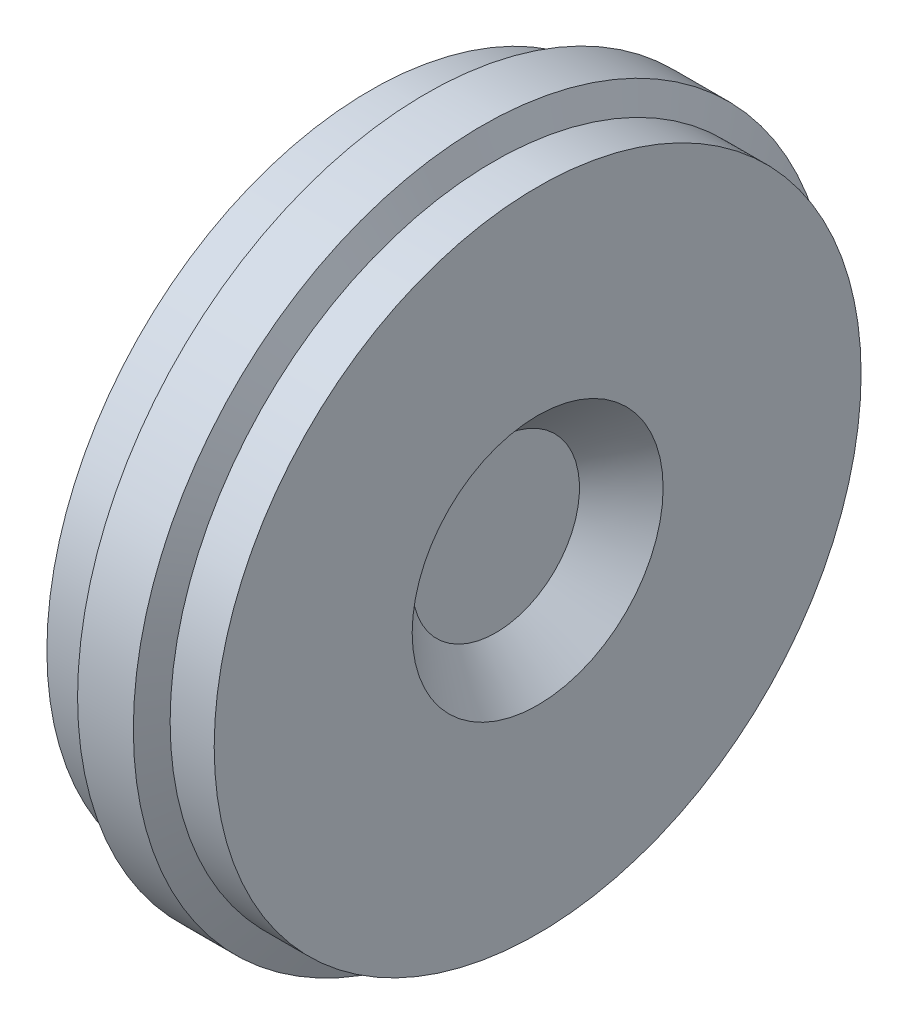
ISO-10303-21;
HEADER;
FILE_DESCRIPTION(('STEP AP214'),'2;1');
FILE_NAME('part.step','',(''),(''),'','','');
FILE_SCHEMA(('AUTOMOTIVE_DESIGN { 1 0 10303 214 1 1 1 1 }'));
ENDSEC;
DATA;
#1=APPLICATION_CONTEXT('core data for automotive mechanical design processes');
#2=APPLICATION_PROTOCOL_DEFINITION('international standard','automotive_design',2000,#1);
#3=PRODUCT_CONTEXT('',#1,'mechanical');
#4=PRODUCT('Part','Part','',(#3));
#5=PRODUCT_RELATED_PRODUCT_CATEGORY('part','',(#4));
#6=PRODUCT_DEFINITION_FORMATION('','',#4);
#7=PRODUCT_DEFINITION_CONTEXT('part definition',#1,'design');
#8=PRODUCT_DEFINITION('design','',#6,#7);
#9=PRODUCT_DEFINITION_SHAPE('','',#8);
#10=(LENGTH_UNIT() NAMED_UNIT(*) SI_UNIT(.MILLI.,.METRE.));
#11=(NAMED_UNIT(*) PLANE_ANGLE_UNIT() SI_UNIT($,.RADIAN.));
#12=(NAMED_UNIT(*) SI_UNIT($,.STERADIAN.) SOLID_ANGLE_UNIT());
#13=UNCERTAINTY_MEASURE_WITH_UNIT(LENGTH_MEASURE(1.E-05),#10,'distance_accuracy_value','');
#14=(GEOMETRIC_REPRESENTATION_CONTEXT(3) GLOBAL_UNCERTAINTY_ASSIGNED_CONTEXT((#13)) GLOBAL_UNIT_ASSIGNED_CONTEXT((#10,
#11,#12)) REPRESENTATION_CONTEXT('',''));
#15=CARTESIAN_POINT('',(0.,0.,0.));
#16=DIRECTION('',(0.,0.,1.));
#17=DIRECTION('',(1.,0.,0.));
#18=AXIS2_PLACEMENT_3D('',#15,#16,#17);
#19=CARTESIAN_POINT('',(0.,0.,0.));
#20=DIRECTION('',(-1.,0.,0.));
#21=DIRECTION('',(0.,0.,1.));
#22=AXIS2_PLACEMENT_3D('',#19,#20,#21);
#23=CYLINDRICAL_SURFACE('',#22,125.);
#24=CARTESIAN_POINT('',(-10.,0.,0.));
#25=DIRECTION('',(-1.,0.,0.));
#26=DIRECTION('',(0.,0.,1.));
#27=AXIS2_PLACEMENT_3D('',#24,#25,#26);
#28=CIRCLE('',#27,125.);
#29=CARTESIAN_POINT('',(-10.,0.,125.));
#30=VERTEX_POINT('',#29);
#31=EDGE_CURVE('E10',#30,#30,#28,.T.);
#32=ORIENTED_EDGE('',*,*,#31,.F.);
#33=EDGE_LOOP('',(#32));
#34=FACE_BOUND('',#33,.T.);
#35=CARTESIAN_POINT('',(10.,0.,0.));
#36=DIRECTION('',(-1.,0.,0.));
#37=DIRECTION('',(0.,0.,1.));
#38=AXIS2_PLACEMENT_3D('',#35,#36,#37);
#39=CIRCLE('',#38,125.);
#40=CARTESIAN_POINT('',(10.,0.,125.));
#41=VERTEX_POINT('',#40);
#42=EDGE_CURVE('E55',#41,#41,#39,.T.);
#43=ORIENTED_EDGE('',*,*,#42,.T.);
#44=EDGE_LOOP('',(#43));
#45=FACE_BOUND('',#44,.T.);
#46=ADVANCED_FACE('F33',(#34,#45),#23,.T.);
#47=CARTESIAN_POINT('',(-10.,0.,0.));
#48=DIRECTION('',(1.,0.,0.));
#49=DIRECTION('',(0.,0.,-1.));
#50=AXIS2_PLACEMENT_3D('',#47,#48,#49);
#51=CONICAL_SURFACE('',#50,125.,1.13446401379632);
#52=CARTESIAN_POINT('',(-14.196768923395,0.,0.));
#53=DIRECTION('',(-1.,0.,0.));
#54=DIRECTION('',(0.,0.,1.));
#55=AXIS2_PLACEMENT_3D('',#52,#53,#54);
#56=CIRCLE('',#55,116.);
#57=CARTESIAN_POINT('',(-14.196768923395,0.,116.));
#58=VERTEX_POINT('',#57);
#59=EDGE_CURVE('E39',#58,#58,#56,.T.);
#60=ORIENTED_EDGE('',*,*,#59,.F.);
#61=EDGE_LOOP('',(#60));
#62=FACE_BOUND('',#61,.T.);
#63=ORIENTED_EDGE('',*,*,#31,.T.);
#64=EDGE_LOOP('',(#63));
#65=FACE_BOUND('',#64,.T.);
#66=ADVANCED_FACE('F83',(#62,#65),#51,.T.);
#67=CARTESIAN_POINT('',(0.,0.,0.));
#68=DIRECTION('',(-1.,0.,0.));
#69=DIRECTION('',(0.,0.,1.));
#70=AXIS2_PLACEMENT_3D('',#67,#68,#69);
#71=CYLINDRICAL_SURFACE('',#70,116.);
#72=CARTESIAN_POINT('',(-30.,0.,0.));
#73=DIRECTION('',(-1.,0.,0.));
#74=DIRECTION('',(0.,0.,1.));
#75=AXIS2_PLACEMENT_3D('',#72,#73,#74);
#76=CIRCLE('',#75,116.);
#77=CARTESIAN_POINT('',(-30.,0.,116.));
#78=VERTEX_POINT('',#77);
#79=EDGE_CURVE('E43',#78,#78,#76,.T.);
#80=ORIENTED_EDGE('',*,*,#79,.F.);
#81=EDGE_LOOP('',(#80));
#82=FACE_BOUND('',#81,.T.);
#83=ORIENTED_EDGE('',*,*,#59,.T.);
#84=EDGE_LOOP('',(#83));
#85=FACE_BOUND('',#84,.T.);
#86=ADVANCED_FACE('F88',(#82,#85),#71,.T.);
#87=CARTESIAN_POINT('',(-30.,116.,0.));
#88=DIRECTION('',(1.,0.,0.));
#89=DIRECTION('',(0.,0.,-1.));
#90=AXIS2_PLACEMENT_3D('',#87,#88,#89);
#91=PLANE('',#90);
#92=CARTESIAN_POINT('',(-30.,0.,0.));
#93=DIRECTION('',(-1.,0.,0.));
#94=DIRECTION('',(0.,0.,1.));
#95=AXIS2_PLACEMENT_3D('',#92,#93,#94);
#96=CIRCLE('',#95,44.9999999999999);
#97=CARTESIAN_POINT('',(-30.,0.,44.9999999999999));
#98=VERTEX_POINT('',#97);
#99=EDGE_CURVE('E47',#98,#98,#96,.T.);
#100=ORIENTED_EDGE('',*,*,#99,.F.);
#101=EDGE_LOOP('',(#100));
#102=FACE_BOUND('',#101,.T.);
#103=ORIENTED_EDGE('',*,*,#79,.T.);
#104=EDGE_LOOP('',(#103));
#105=FACE_BOUND('',#104,.T.);
#106=ADVANCED_FACE('F112',(#102,#105),#91,.F.);
#107=CARTESIAN_POINT('',(-30.,0.,0.));
#108=DIRECTION('',(-1.,0.,0.));
#109=DIRECTION('',(0.,0.,1.));
#110=AXIS2_PLACEMENT_3D('',#107,#108,#109);
#111=CONICAL_SURFACE('',#110,44.9999999999999,0.785398163397446);
#112=CARTESIAN_POINT('',(-15.,0.,0.));
#113=DIRECTION('',(-1.,0.,0.));
#114=DIRECTION('',(0.,0.,1.));
#115=AXIS2_PLACEMENT_3D('',#112,#113,#114);
#116=CIRCLE('',#115,30.);
#117=CARTESIAN_POINT('',(-15.,0.,30.));
#118=VERTEX_POINT('',#117);
#119=EDGE_CURVE('E52',#118,#118,#116,.T.);
#120=ORIENTED_EDGE('',*,*,#119,.F.);
#121=EDGE_LOOP('',(#120));
#122=FACE_BOUND('',#121,.T.);
#123=ORIENTED_EDGE('',*,*,#99,.T.);
#124=EDGE_LOOP('',(#123));
#125=FACE_BOUND('',#124,.T.);
#126=ADVANCED_FACE('F105',(#122,#125),#111,.F.);
#127=CARTESIAN_POINT('',(-15.,30.,0.));
#128=DIRECTION('',(1.,0.,0.));
#129=DIRECTION('',(0.,0.,-1.));
#130=AXIS2_PLACEMENT_3D('',#127,#128,#129);
#131=PLANE('',#130);
#132=ORIENTED_EDGE('',*,*,#119,.T.);
#133=EDGE_LOOP('',(#132));
#134=FACE_BOUND('',#133,.T.);
#135=ADVANCED_FACE('F96',(#134),#131,.F.);
#136=CARTESIAN_POINT('',(10.,0.,0.));
#137=DIRECTION('',(-1.,0.,0.));
#138=DIRECTION('',(0.,0.,-1.));
#139=AXIS2_PLACEMENT_3D('',#136,#137,#138);
#140=CONICAL_SURFACE('',#139,125.,1.13446401379632);
#141=CARTESIAN_POINT('',(14.196768923395,0.,0.));
#142=DIRECTION('',(-1.,0.,0.));
#143=DIRECTION('',(0.,0.,1.));
#144=AXIS2_PLACEMENT_3D('',#141,#142,#143);
#145=CIRCLE('',#144,116.);
#146=CARTESIAN_POINT('',(14.196768923395,0.,116.));
#147=VERTEX_POINT('',#146);
#148=EDGE_CURVE('E58',#147,#147,#145,.T.);
#149=ORIENTED_EDGE('',*,*,#148,.T.);
#150=EDGE_LOOP('',(#149));
#151=FACE_BOUND('',#150,.T.);
#152=ORIENTED_EDGE('',*,*,#42,.F.);
#153=EDGE_LOOP('',(#152));
#154=FACE_BOUND('',#153,.T.);
#155=ADVANCED_FACE('F93',(#151,#154),#140,.T.);
#156=CARTESIAN_POINT('',(0.,0.,0.));
#157=DIRECTION('',(1.,0.,0.));
#158=DIRECTION('',(0.,0.,1.));
#159=AXIS2_PLACEMENT_3D('',#156,#157,#158);
#160=CYLINDRICAL_SURFACE('',#159,116.);
#161=CARTESIAN_POINT('',(30.,0.,0.));
#162=DIRECTION('',(-1.,0.,0.));
#163=DIRECTION('',(0.,0.,1.));
#164=AXIS2_PLACEMENT_3D('',#161,#162,#163);
#165=CIRCLE('',#164,116.);
#166=CARTESIAN_POINT('',(30.,0.,116.));
#167=VERTEX_POINT('',#166);
#168=EDGE_CURVE('E61',#167,#167,#165,.T.);
#169=ORIENTED_EDGE('',*,*,#168,.T.);
#170=EDGE_LOOP('',(#169));
#171=FACE_BOUND('',#170,.T.);
#172=ORIENTED_EDGE('',*,*,#148,.F.);
#173=EDGE_LOOP('',(#172));
#174=FACE_BOUND('',#173,.T.);
#175=ADVANCED_FACE('F95',(#171,#174),#160,.T.);
#176=CARTESIAN_POINT('',(30.,116.,0.));
#177=DIRECTION('',(-1.,0.,0.));
#178=DIRECTION('',(0.,0.,-1.));
#179=AXIS2_PLACEMENT_3D('',#176,#177,#178);
#180=PLANE('',#179);
#181=CARTESIAN_POINT('',(30.,0.,0.));
#182=DIRECTION('',(-1.,0.,0.));
#183=DIRECTION('',(0.,0.,1.));
#184=AXIS2_PLACEMENT_3D('',#181,#182,#183);
#185=CIRCLE('',#184,44.9999999999999);
#186=CARTESIAN_POINT('',(30.,0.,44.9999999999999));
#187=VERTEX_POINT('',#186);
#188=EDGE_CURVE('E64',#187,#187,#185,.T.);
#189=ORIENTED_EDGE('',*,*,#188,.T.);
#190=EDGE_LOOP('',(#189));
#191=FACE_BOUND('',#190,.T.);
#192=ORIENTED_EDGE('',*,*,#168,.F.);
#193=EDGE_LOOP('',(#192));
#194=FACE_BOUND('',#193,.T.);
#195=ADVANCED_FACE('F80',(#191,#194),#180,.F.);
#196=CARTESIAN_POINT('',(30.,0.,0.));
#197=DIRECTION('',(1.,0.,0.));
#198=DIRECTION('',(0.,0.,1.));
#199=AXIS2_PLACEMENT_3D('',#196,#197,#198);
#200=CONICAL_SURFACE('',#199,44.9999999999999,0.785398163397446);
#201=CARTESIAN_POINT('',(15.,0.,0.));
#202=DIRECTION('',(-1.,0.,0.));
#203=DIRECTION('',(0.,0.,1.));
#204=AXIS2_PLACEMENT_3D('',#201,#202,#203);
#205=CIRCLE('',#204,30.);
#206=CARTESIAN_POINT('',(15.,0.,30.));
#207=VERTEX_POINT('',#206);
#208=EDGE_CURVE('E67',#207,#207,#205,.T.);
#209=ORIENTED_EDGE('',*,*,#208,.T.);
#210=EDGE_LOOP('',(#209));
#211=FACE_BOUND('',#210,.T.);
#212=ORIENTED_EDGE('',*,*,#188,.F.);
#213=EDGE_LOOP('',(#212));
#214=FACE_BOUND('',#213,.T.);
#215=ADVANCED_FACE('F71',(#211,#214),#200,.F.);
#216=CARTESIAN_POINT('',(15.,30.,0.));
#217=DIRECTION('',(-1.,0.,0.));
#218=DIRECTION('',(0.,0.,-1.));
#219=AXIS2_PLACEMENT_3D('',#216,#217,#218);
#220=PLANE('',#219);
#221=ORIENTED_EDGE('',*,*,#208,.F.);
#222=EDGE_LOOP('',(#221));
#223=FACE_BOUND('',#222,.T.);
#224=ADVANCED_FACE('F74',(#223),#220,.F.);
#225=CLOSED_SHELL('',(#46,#66,#86,#106,#126,#135,#155,#175,#195,#215,#224));
#226=MANIFOLD_SOLID_BREP('B2',#225);
#227=ADVANCED_BREP_SHAPE_REPRESENTATION('',(#18,#226),#14);
#228=SHAPE_DEFINITION_REPRESENTATION(#9,#227);
ENDSEC;
END-ISO-10303-21;
